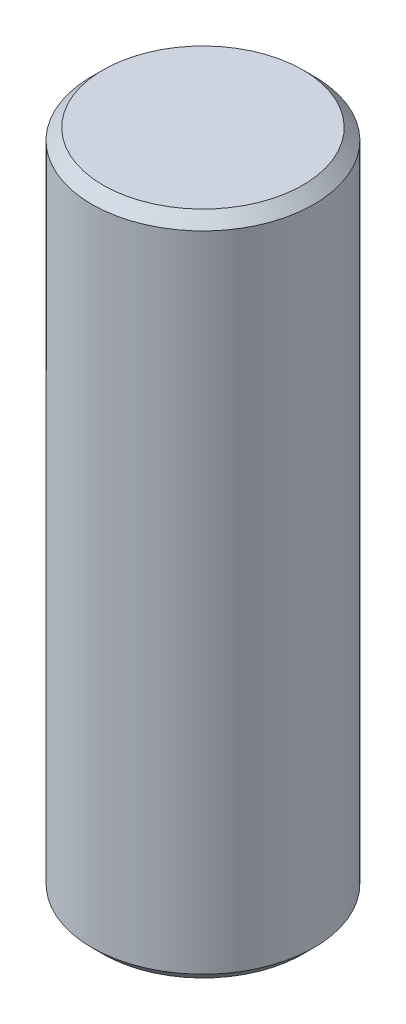
ISO-10303-21;
HEADER;
FILE_DESCRIPTION(('STEP AP214'),'2;1');
FILE_NAME('part.step','',(''),(''),'','','');
FILE_SCHEMA(('AUTOMOTIVE_DESIGN { 1 0 10303 214 1 1 1 1 }'));
ENDSEC;
DATA;
#1=APPLICATION_CONTEXT('core data for automotive mechanical design processes');
#2=APPLICATION_PROTOCOL_DEFINITION('international standard','automotive_design',2000,#1);
#3=PRODUCT_CONTEXT('',#1,'mechanical');
#4=PRODUCT('Part','Part','',(#3));
#5=PRODUCT_RELATED_PRODUCT_CATEGORY('part','',(#4));
#6=PRODUCT_DEFINITION_FORMATION('','',#4);
#7=PRODUCT_DEFINITION_CONTEXT('part definition',#1,'design');
#8=PRODUCT_DEFINITION('design','',#6,#7);
#9=PRODUCT_DEFINITION_SHAPE('','',#8);
#10=(LENGTH_UNIT() NAMED_UNIT(*) SI_UNIT(.MILLI.,.METRE.));
#11=(NAMED_UNIT(*) PLANE_ANGLE_UNIT() SI_UNIT($,.RADIAN.));
#12=(NAMED_UNIT(*) SI_UNIT($,.STERADIAN.) SOLID_ANGLE_UNIT());
#13=UNCERTAINTY_MEASURE_WITH_UNIT(LENGTH_MEASURE(1.E-05),#10,'distance_accuracy_value','');
#14=(GEOMETRIC_REPRESENTATION_CONTEXT(3) GLOBAL_UNCERTAINTY_ASSIGNED_CONTEXT((#13)) GLOBAL_UNIT_ASSIGNED_CONTEXT((#10,
#11,#12)) REPRESENTATION_CONTEXT('',''));
#15=CARTESIAN_POINT('',(0.,0.,0.));
#16=DIRECTION('',(0.,0.,1.));
#17=DIRECTION('',(1.,0.,0.));
#18=AXIS2_PLACEMENT_3D('',#15,#16,#17);
#19=CARTESIAN_POINT('',(0.,12.,0.));
#20=DIRECTION('',(0.,-1.,0.));
#21=DIRECTION('',(0.,0.,-1.));
#22=AXIS2_PLACEMENT_3D('',#19,#20,#21);
#23=CYLINDRICAL_SURFACE('',#22,2.);
#24=CARTESIAN_POINT('',(0.,0.199999999999995,0.));
#25=DIRECTION('',(0.,1.,0.));
#26=DIRECTION('',(0.,0.,1.));
#27=AXIS2_PLACEMENT_3D('',#24,#25,#26);
#28=CIRCLE('',#27,2.);
#29=CARTESIAN_POINT('',(0.,0.199999999999995,2.));
#30=VERTEX_POINT('',#29);
#31=EDGE_CURVE('E53',#30,#30,#28,.T.);
#32=ORIENTED_EDGE('',*,*,#31,.T.);
#33=EDGE_LOOP('',(#32));
#34=FACE_BOUND('',#33,.T.);
#35=CARTESIAN_POINT('',(0.,11.8,0.));
#36=DIRECTION('',(0.,1.,0.));
#37=DIRECTION('',(0.,0.,1.));
#38=AXIS2_PLACEMENT_3D('',#35,#36,#37);
#39=CIRCLE('',#38,2.);
#40=CARTESIAN_POINT('',(0.,11.8,2.));
#41=VERTEX_POINT('',#40);
#42=EDGE_CURVE('E58',#41,#41,#39,.F.);
#43=ORIENTED_EDGE('',*,*,#42,.T.);
#44=EDGE_LOOP('',(#43));
#45=FACE_BOUND('',#44,.T.);
#46=ADVANCED_FACE('F39',(#34,#45),#23,.T.);
#47=CARTESIAN_POINT('',(0.,12.,0.));
#48=DIRECTION('',(0.,1.,0.));
#49=DIRECTION('',(0.,0.,1.));
#50=AXIS2_PLACEMENT_3D('',#47,#48,#49);
#51=PLANE('',#50);
#52=CARTESIAN_POINT('',(0.,12.,0.));
#53=DIRECTION('',(0.,1.,0.));
#54=DIRECTION('',(0.,0.,1.));
#55=AXIS2_PLACEMENT_3D('',#52,#53,#54);
#56=CIRCLE('',#55,1.8);
#57=CARTESIAN_POINT('',(0.,12.,1.8));
#58=VERTEX_POINT('',#57);
#59=EDGE_CURVE('E10',#58,#58,#56,.T.);
#60=ORIENTED_EDGE('',*,*,#59,.T.);
#61=EDGE_LOOP('',(#60));
#62=FACE_BOUND('',#61,.T.);
#63=ADVANCED_FACE('F75',(#62),#51,.T.);
#64=CARTESIAN_POINT('',(0.,0.,0.));
#65=DIRECTION('',(0.,1.,0.));
#66=DIRECTION('',(0.,0.,1.));
#67=AXIS2_PLACEMENT_3D('',#64,#65,#66);
#68=PLANE('',#67);
#69=CARTESIAN_POINT('',(0.,0.,0.));
#70=DIRECTION('',(0.,1.,0.));
#71=DIRECTION('',(0.,0.,1.));
#72=AXIS2_PLACEMENT_3D('',#69,#70,#71);
#73=CIRCLE('',#72,1.8);
#74=CARTESIAN_POINT('',(0.,0.,1.8));
#75=VERTEX_POINT('',#74);
#76=EDGE_CURVE('E48',#75,#75,#73,.F.);
#77=ORIENTED_EDGE('',*,*,#76,.T.);
#78=EDGE_LOOP('',(#77));
#79=FACE_BOUND('',#78,.T.);
#80=ADVANCED_FACE('F72',(#79),#68,.F.);
#81=CARTESIAN_POINT('',(0.,0.199999999999995,0.));
#82=DIRECTION('',(0.,1.,0.));
#83=DIRECTION('',(0.,0.,1.));
#84=AXIS2_PLACEMENT_3D('',#81,#82,#83);
#85=CONICAL_SURFACE('',#84,2.,0.785398163397453);
#86=ORIENTED_EDGE('',*,*,#76,.F.);
#87=EDGE_LOOP('',(#86));
#88=FACE_BOUND('',#87,.T.);
#89=ORIENTED_EDGE('',*,*,#31,.F.);
#90=EDGE_LOOP('',(#89));
#91=FACE_BOUND('',#90,.T.);
#92=ADVANCED_FACE('F68',(#88,#91),#85,.T.);
#93=CARTESIAN_POINT('',(0.,12.,0.));
#94=DIRECTION('',(0.,-1.,0.));
#95=DIRECTION('',(0.,0.,-1.));
#96=AXIS2_PLACEMENT_3D('',#93,#94,#95);
#97=CONICAL_SURFACE('',#96,1.8,0.785398163397444);
#98=ORIENTED_EDGE('',*,*,#42,.F.);
#99=EDGE_LOOP('',(#98));
#100=FACE_BOUND('',#99,.T.);
#101=ORIENTED_EDGE('',*,*,#59,.F.);
#102=EDGE_LOOP('',(#101));
#103=FACE_BOUND('',#102,.T.);
#104=ADVANCED_FACE('F42',(#100,#103),#97,.T.);
#105=CLOSED_SHELL('',(#46,#63,#80,#92,#104));
#106=MANIFOLD_SOLID_BREP('B2',#105);
#107=ADVANCED_BREP_SHAPE_REPRESENTATION('',(#18,#106),#14);
#108=SHAPE_DEFINITION_REPRESENTATION(#9,#107);
ENDSEC;
END-ISO-10303-21;
